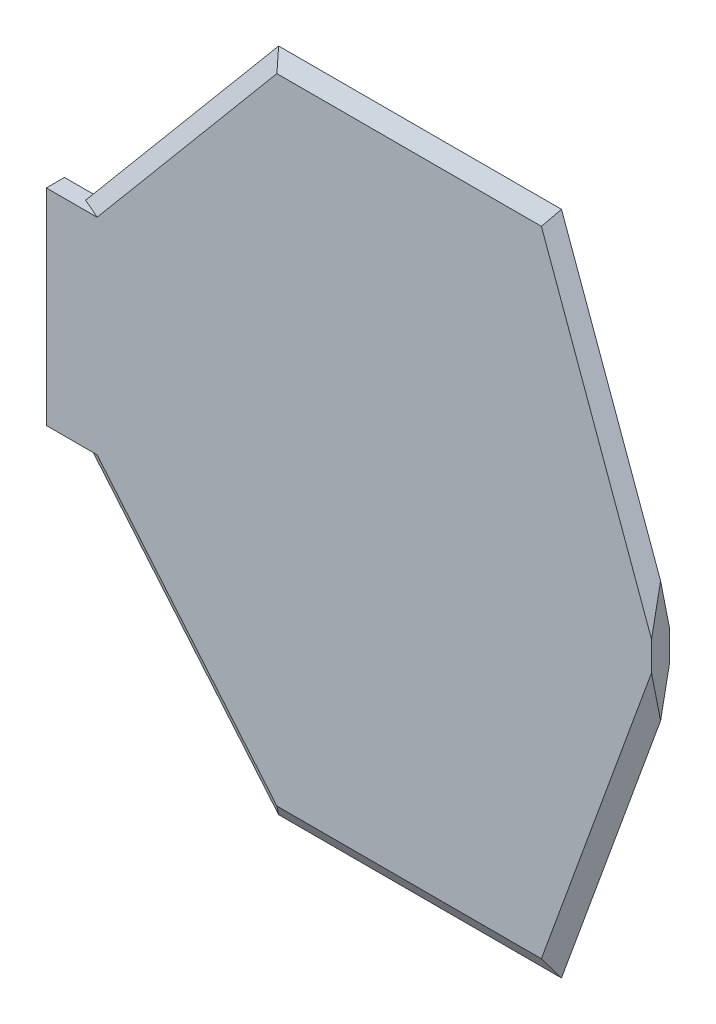
ISO-10303-21;
HEADER;
FILE_DESCRIPTION(('STEP AP214'),'2;1');
FILE_NAME('part.step','',(''),(''),'','','');
FILE_SCHEMA(('AUTOMOTIVE_DESIGN { 1 0 10303 214 1 1 1 1 }'));
ENDSEC;
DATA;
#1=APPLICATION_CONTEXT('core data for automotive mechanical design processes');
#2=APPLICATION_PROTOCOL_DEFINITION('international standard','automotive_design',2000,#1);
#3=PRODUCT_CONTEXT('',#1,'mechanical');
#4=PRODUCT('Part','Part','',(#3));
#5=PRODUCT_RELATED_PRODUCT_CATEGORY('part','',(#4));
#6=PRODUCT_DEFINITION_FORMATION('','',#4);
#7=PRODUCT_DEFINITION_CONTEXT('part definition',#1,'design');
#8=PRODUCT_DEFINITION('design','',#6,#7);
#9=PRODUCT_DEFINITION_SHAPE('','',#8);
#10=(LENGTH_UNIT() NAMED_UNIT(*) SI_UNIT(.MILLI.,.METRE.));
#11=(NAMED_UNIT(*) PLANE_ANGLE_UNIT() SI_UNIT($,.RADIAN.));
#12=(NAMED_UNIT(*) SI_UNIT($,.STERADIAN.) SOLID_ANGLE_UNIT());
#13=UNCERTAINTY_MEASURE_WITH_UNIT(LENGTH_MEASURE(1.E-05),#10,'distance_accuracy_value','');
#14=(GEOMETRIC_REPRESENTATION_CONTEXT(3) GLOBAL_UNCERTAINTY_ASSIGNED_CONTEXT((#13)) GLOBAL_UNIT_ASSIGNED_CONTEXT((#10,
#11,#12)) REPRESENTATION_CONTEXT('',''));
#15=CARTESIAN_POINT('',(0.,0.,0.));
#16=DIRECTION('',(0.,0.,1.));
#17=DIRECTION('',(1.,0.,0.));
#18=AXIS2_PLACEMENT_3D('',#15,#16,#17);
#19=CARTESIAN_POINT('',(40.,-17.,1.5));
#20=DIRECTION('',(1.,0.,0.));
#21=DIRECTION('',(0.,0.,-1.));
#22=AXIS2_PLACEMENT_3D('',#19,#20,#21);
#23=PLANE('',#22);
#24=DIRECTION('',(0.,-1.,0.));
#25=VECTOR('',#24,1.);
#26=CARTESIAN_POINT('',(40.,-17.,-1.5));
#27=LINE('',#26,#25);
#28=CARTESIAN_POINT('',(40.,17.,-1.5));
#29=VERTEX_POINT('',#28);
#30=CARTESIAN_POINT('',(40.,-17.,-1.5));
#31=VERTEX_POINT('',#30);
#32=EDGE_CURVE('E165',#29,#31,#27,.T.);
#33=ORIENTED_EDGE('',*,*,#32,.T.);
#34=DIRECTION('',(0.,0.,-1.));
#35=VECTOR('',#34,1.);
#36=CARTESIAN_POINT('',(40.,-17.,1.5));
#37=LINE('',#36,#35);
#38=CARTESIAN_POINT('',(40.,-17.,1.5));
#39=VERTEX_POINT('',#38);
#40=EDGE_CURVE('E152',#39,#31,#37,.T.);
#41=ORIENTED_EDGE('',*,*,#40,.F.);
#42=DIRECTION('',(0.,-1.,0.));
#43=VECTOR('',#42,1.);
#44=CARTESIAN_POINT('',(40.,-17.,1.5));
#45=LINE('',#44,#43);
#46=CARTESIAN_POINT('',(40.,17.,1.5));
#47=VERTEX_POINT('',#46);
#48=EDGE_CURVE('E147',#47,#39,#45,.T.);
#49=ORIENTED_EDGE('',*,*,#48,.F.);
#50=DIRECTION('',(0.,0.,-1.));
#51=VECTOR('',#50,1.);
#52=CARTESIAN_POINT('',(40.,17.,1.5));
#53=LINE('',#52,#51);
#54=EDGE_CURVE('E149',#47,#29,#53,.T.);
#55=ORIENTED_EDGE('',*,*,#54,.T.);
#56=EDGE_LOOP('',(#33,#41,#49,#55));
#57=FACE_BOUND('',#56,.T.);
#58=ADVANCED_FACE('F45',(#57),#23,.F.);
#59=CARTESIAN_POINT('',(45.,-17.,1.5));
#60=DIRECTION('',(0.,1.,0.));
#61=DIRECTION('',(0.,0.,1.));
#62=AXIS2_PLACEMENT_3D('',#59,#60,#61);
#63=PLANE('',#62);
#64=DIRECTION('',(1.,0.,0.));
#65=VECTOR('',#64,1.);
#66=CARTESIAN_POINT('',(45.,-17.,-1.5));
#67=LINE('',#66,#65);
#68=CARTESIAN_POINT('',(48.3915476245414,-17.,-1.5));
#69=VERTEX_POINT('',#68);
#70=EDGE_CURVE('E179',#31,#69,#67,.T.);
#71=ORIENTED_EDGE('',*,*,#70,.T.);
#72=DIRECTION('',(0.91454607135198,0.,-0.404481746652007));
#73=VECTOR('',#72,1.);
#74=CARTESIAN_POINT('',(44.4451242114987,-17.,0.245408225062));
#75=LINE('',#74,#73);
#76=CARTESIAN_POINT('',(45.,-17.,0.));
#77=VERTEX_POINT('',#76);
#78=EDGE_CURVE('E11',#69,#77,#75,.F.);
#79=ORIENTED_EDGE('',*,*,#78,.T.);
#80=DIRECTION('',(0.91454607135198,0.,0.404481746652007));
#81=VECTOR('',#80,1.);
#82=CARTESIAN_POINT('',(45.5548757885013,-17.,0.245408225061977));
#83=LINE('',#82,#81);
#84=CARTESIAN_POINT('',(48.3915476245414,-17.,1.5));
#85=VERTEX_POINT('',#84);
#86=EDGE_CURVE('E244',#77,#85,#83,.T.);
#87=ORIENTED_EDGE('',*,*,#86,.T.);
#88=DIRECTION('',(1.,0.,0.));
#89=VECTOR('',#88,1.);
#90=CARTESIAN_POINT('',(45.,-17.,1.5));
#91=LINE('',#90,#89);
#92=EDGE_CURVE('E156',#39,#85,#91,.T.);
#93=ORIENTED_EDGE('',*,*,#92,.F.);
#94=ORIENTED_EDGE('',*,*,#40,.T.);
#95=EDGE_LOOP('',(#71,#79,#87,#93,#94));
#96=FACE_BOUND('',#95,.T.);
#97=ADVANCED_FACE('F270',(#96),#63,.F.);
#98=CARTESIAN_POINT('',(140.,-10.,1.5));
#99=DIRECTION('',(-1.,0.,0.));
#100=DIRECTION('',(0.,0.,1.));
#101=AXIS2_PLACEMENT_3D('',#98,#99,#100);
#102=PLANE('',#101);
#103=DIRECTION('',(0.,-0.981055946010023,-0.19372462620529));
#104=VECTOR('',#103,1.);
#105=CARTESIAN_POINT('',(140.,-43.6673410123509,-6.64813569447251));
#106=LINE('',#105,#104);
#107=CARTESIAN_POINT('',(140.,-2.40373334128617,1.5));
#108=VERTEX_POINT('',#107);
#109=CARTESIAN_POINT('',(140.,-10.,0.));
#110=VERTEX_POINT('',#109);
#111=EDGE_CURVE('E232',#108,#110,#106,.T.);
#112=ORIENTED_EDGE('',*,*,#111,.T.);
#113=DIRECTION('',(0.,-0.981055946010023,0.19372462620529));
#114=VECTOR('',#113,1.);
#115=CARTESIAN_POINT('',(140.,-53.3111846140729,8.55246133922713));
#116=LINE('',#115,#114);
#117=CARTESIAN_POINT('',(140.,-2.40373334128618,-1.5));
#118=VERTEX_POINT('',#117);
#119=EDGE_CURVE('E247',#110,#118,#116,.F.);
#120=ORIENTED_EDGE('',*,*,#119,.T.);
#121=DIRECTION('',(0.,1.,0.));
#122=VECTOR('',#121,1.);
#123=CARTESIAN_POINT('',(140.,-10.,-1.5));
#124=LINE('',#123,#122);
#125=CARTESIAN_POINT('',(140.,2.40373334128617,-1.5));
#126=VERTEX_POINT('',#125);
#127=EDGE_CURVE('E157',#118,#126,#124,.T.);
#128=ORIENTED_EDGE('',*,*,#127,.T.);
#129=DIRECTION('',(0.,0.981055946010023,0.19372462620529));
#130=VECTOR('',#129,1.);
#131=CARTESIAN_POINT('',(140.,43.6673410123509,6.64813569447251));
#132=LINE('',#131,#130);
#133=CARTESIAN_POINT('',(140.,10.,0.));
#134=VERTEX_POINT('',#133);
#135=EDGE_CURVE('E215',#126,#134,#132,.T.);
#136=ORIENTED_EDGE('',*,*,#135,.T.);
#137=DIRECTION('',(0.,0.981055946010023,-0.19372462620529));
#138=VECTOR('',#137,1.);
#139=CARTESIAN_POINT('',(140.,53.3111846140729,-8.55246133922713));
#140=LINE('',#139,#138);
#141=CARTESIAN_POINT('',(140.,2.4037333412862,1.5));
#142=VERTEX_POINT('',#141);
#143=EDGE_CURVE('E186',#134,#142,#140,.F.);
#144=ORIENTED_EDGE('',*,*,#143,.T.);
#145=DIRECTION('',(0.,1.,0.));
#146=VECTOR('',#145,1.);
#147=CARTESIAN_POINT('',(140.,-10.,1.5));
#148=LINE('',#147,#146);
#149=EDGE_CURVE('E176',#108,#142,#148,.T.);
#150=ORIENTED_EDGE('',*,*,#149,.F.);
#151=EDGE_LOOP('',(#112,#120,#128,#136,#144,#150));
#152=FACE_BOUND('',#151,.T.);
#153=ADVANCED_FACE('F286',(#152),#102,.F.);
#154=CARTESIAN_POINT('',(0.,0.,1.5));
#155=DIRECTION('',(0.,0.,1.));
#156=DIRECTION('',(1.,0.,0.));
#157=AXIS2_PLACEMENT_3D('',#154,#155,#156);
#158=PLANE('',#157);
#159=DIRECTION('',(1.,0.,0.));
#160=VECTOR('',#159,1.);
#161=CARTESIAN_POINT('',(123.621339458021,-52.4019237886467,1.5));
#162=LINE('',#161,#160);
#163=CARTESIAN_POINT('',(78.0972888185607,-52.4019237886467,1.5));
#164=VERTEX_POINT('',#163);
#165=CARTESIAN_POINT('',(121.802146909988,-52.4019237886467,1.5));
#166=VERTEX_POINT('',#165);
#167=EDGE_CURVE('E227',#164,#166,#162,.T.);
#168=ORIENTED_EDGE('',*,*,#167,.T.);
#169=DIRECTION('',(0.34202014332567,0.939692620785908,0.));
#170=VECTOR('',#169,1.);
#171=CARTESIAN_POINT('',(137.558606955952,-9.11140560182193,1.5));
#172=LINE('',#171,#170);
#173=EDGE_CURVE('E229',#166,#108,#172,.T.);
#174=ORIENTED_EDGE('',*,*,#173,.T.);
#175=ORIENTED_EDGE('',*,*,#149,.T.);
#176=DIRECTION('',(-0.34202014332567,0.939692620785908,0.));
#177=VECTOR('',#176,1.);
#178=CARTESIAN_POINT('',(124.395656022713,45.2763160642849,1.5));
#179=LINE('',#178,#177);
#180=CARTESIAN_POINT('',(121.802146909988,52.4019237886467,1.5));
#181=VERTEX_POINT('',#180);
#182=EDGE_CURVE('E192',#142,#181,#179,.T.);
#183=ORIENTED_EDGE('',*,*,#182,.T.);
#184=DIRECTION('',(-1.,0.,0.));
#185=VECTOR('',#184,1.);
#186=CARTESIAN_POINT('',(0.,52.4019237886467,1.5));
#187=LINE('',#186,#185);
#188=CARTESIAN_POINT('',(78.0972888185607,52.4019237886467,1.5));
#189=VERTEX_POINT('',#188);
#190=EDGE_CURVE('E190',#181,#189,#187,.T.);
#191=ORIENTED_EDGE('',*,*,#190,.T.);
#192=DIRECTION('',(-0.642787609686535,-0.766044443118982,0.));
#193=VECTOR('',#192,1.);
#194=CARTESIAN_POINT('',(20.0264599414093,-16.8041951506229,1.5));
#195=LINE('',#194,#193);
#196=CARTESIAN_POINT('',(48.3915476245414,17.,1.5));
#197=VERTEX_POINT('',#196);
#198=EDGE_CURVE('E169',#189,#197,#195,.T.);
#199=ORIENTED_EDGE('',*,*,#198,.T.);
#200=DIRECTION('',(1.,0.,0.));
#201=VECTOR('',#200,1.);
#202=CARTESIAN_POINT('',(45.,17.,1.5));
#203=LINE('',#202,#201);
#204=EDGE_CURVE('E161',#47,#197,#203,.T.);
#205=ORIENTED_EDGE('',*,*,#204,.F.);
#206=ORIENTED_EDGE('',*,*,#48,.T.);
#207=ORIENTED_EDGE('',*,*,#92,.T.);
#208=DIRECTION('',(0.642787609686535,-0.766044443118982,0.));
#209=VECTOR('',#208,1.);
#210=CARTESIAN_POINT('',(78.8760278292431,-53.3299888023207,1.5));
#211=LINE('',#210,#209);
#212=EDGE_CURVE('E219',#85,#164,#211,.T.);
#213=ORIENTED_EDGE('',*,*,#212,.T.);
#214=EDGE_LOOP('',(#168,#174,#175,#183,#191,#199,#205,#206,#207,#213));
#215=FACE_BOUND('',#214,.T.);
#216=ADVANCED_FACE('F167',(#215),#158,.T.);
#217=CARTESIAN_POINT('',(0.,0.,-1.5));
#218=DIRECTION('',(0.,0.,1.));
#219=DIRECTION('',(1.,0.,0.));
#220=AXIS2_PLACEMENT_3D('',#217,#218,#219);
#221=PLANE('',#220);
#222=ORIENTED_EDGE('',*,*,#127,.F.);
#223=DIRECTION('',(-0.34202014332567,-0.939692620785908,0.));
#224=VECTOR('',#223,1.);
#225=CARTESIAN_POINT('',(124.395656022713,-45.2763160642849,-1.5));
#226=LINE('',#225,#224);
#227=CARTESIAN_POINT('',(121.802146909988,-52.4019237886467,-1.5));
#228=VERTEX_POINT('',#227);
#229=EDGE_CURVE('E55',#118,#228,#226,.T.);
#230=ORIENTED_EDGE('',*,*,#229,.T.);
#231=DIRECTION('',(-1.,0.,0.));
#232=VECTOR('',#231,1.);
#233=CARTESIAN_POINT('',(0.,-52.4019237886467,-1.5));
#234=LINE('',#233,#232);
#235=CARTESIAN_POINT('',(78.0972888185607,-52.4019237886467,-1.5));
#236=VERTEX_POINT('',#235);
#237=EDGE_CURVE('E66',#228,#236,#234,.T.);
#238=ORIENTED_EDGE('',*,*,#237,.T.);
#239=DIRECTION('',(-0.642787609686535,0.766044443118982,0.));
#240=VECTOR('',#239,1.);
#241=CARTESIAN_POINT('',(20.0264599414093,16.8041951506229,-1.5));
#242=LINE('',#241,#240);
#243=EDGE_CURVE('E254',#236,#69,#242,.T.);
#244=ORIENTED_EDGE('',*,*,#243,.T.);
#245=ORIENTED_EDGE('',*,*,#70,.F.);
#246=ORIENTED_EDGE('',*,*,#32,.F.);
#247=DIRECTION('',(1.,0.,0.));
#248=VECTOR('',#247,1.);
#249=CARTESIAN_POINT('',(45.,17.,-1.5));
#250=LINE('',#249,#248);
#251=CARTESIAN_POINT('',(48.3915476245414,17.,-1.5));
#252=VERTEX_POINT('',#251);
#253=EDGE_CURVE('E164',#29,#252,#250,.T.);
#254=ORIENTED_EDGE('',*,*,#253,.T.);
#255=DIRECTION('',(0.642787609686535,0.766044443118982,0.));
#256=VECTOR('',#255,1.);
#257=CARTESIAN_POINT('',(78.8760278292431,53.3299888023207,-1.5));
#258=LINE('',#257,#256);
#259=CARTESIAN_POINT('',(78.0972888185607,52.4019237886467,-1.5));
#260=VERTEX_POINT('',#259);
#261=EDGE_CURVE('E202',#252,#260,#258,.T.);
#262=ORIENTED_EDGE('',*,*,#261,.T.);
#263=DIRECTION('',(1.,0.,0.));
#264=VECTOR('',#263,1.);
#265=CARTESIAN_POINT('',(123.621339458021,52.4019237886467,-1.5));
#266=LINE('',#265,#264);
#267=CARTESIAN_POINT('',(121.802146909988,52.4019237886467,-1.5));
#268=VERTEX_POINT('',#267);
#269=EDGE_CURVE('E210',#260,#268,#266,.T.);
#270=ORIENTED_EDGE('',*,*,#269,.T.);
#271=DIRECTION('',(0.34202014332567,-0.939692620785908,0.));
#272=VECTOR('',#271,1.);
#273=CARTESIAN_POINT('',(137.558606955952,9.11140560182193,-1.5));
#274=LINE('',#273,#272);
#275=EDGE_CURVE('E212',#268,#126,#274,.T.);
#276=ORIENTED_EDGE('',*,*,#275,.T.);
#277=EDGE_LOOP('',(#222,#230,#238,#244,#245,#246,#254,#262,#270,#276));
#278=FACE_BOUND('',#277,.T.);
#279=ADVANCED_FACE('F268',(#278),#221,.F.);
#280=CARTESIAN_POINT('',(45.,17.,1.5));
#281=DIRECTION('',(0.,1.,0.));
#282=DIRECTION('',(0.,0.,1.));
#283=AXIS2_PLACEMENT_3D('',#280,#281,#282);
#284=PLANE('',#283);
#285=ORIENTED_EDGE('',*,*,#253,.F.);
#286=ORIENTED_EDGE('',*,*,#54,.F.);
#287=ORIENTED_EDGE('',*,*,#204,.T.);
#288=DIRECTION('',(0.91454607135198,0.,0.404481746652007));
#289=VECTOR('',#288,1.);
#290=CARTESIAN_POINT('',(45.,17.,0.));
#291=LINE('',#290,#289);
#292=CARTESIAN_POINT('',(45.,17.,0.));
#293=VERTEX_POINT('',#292);
#294=EDGE_CURVE('E200',#197,#293,#291,.F.);
#295=ORIENTED_EDGE('',*,*,#294,.T.);
#296=DIRECTION('',(0.91454607135198,0.,-0.404481746652007));
#297=VECTOR('',#296,1.);
#298=CARTESIAN_POINT('',(24.6671438227727,17.,8.99273359605708));
#299=LINE('',#298,#297);
#300=EDGE_CURVE('E217',#293,#252,#299,.T.);
#301=ORIENTED_EDGE('',*,*,#300,.T.);
#302=EDGE_LOOP('',(#285,#286,#287,#295,#301));
#303=FACE_BOUND('',#302,.T.);
#304=ADVANCED_FACE('F160',(#303),#284,.T.);
#305=CARTESIAN_POINT('',(45.,17.,0.));
#306=DIRECTION('',(0.38302222155949,-0.321393804843267,-0.866025403784439));
#307=DIRECTION('',(0.642787609686535,0.766044443118982,0.));
#308=AXIS2_PLACEMENT_3D('',#305,#306,#307);
#309=PLANE('',#308);
#310=ORIENTED_EDGE('',*,*,#294,.F.);
#311=ORIENTED_EDGE('',*,*,#198,.F.);
#312=DIRECTION('',(-0.374453581815003,0.803018297611851,-0.463622830290398));
#313=VECTOR('',#312,1.);
#314=CARTESIAN_POINT('',(83.8412419969243,40.0839764465633,8.6117702138155));
#315=LINE('',#314,#313);
#316=CARTESIAN_POINT('',(76.8857859847363,55.,0.));
#317=VERTEX_POINT('',#316);
#318=EDGE_CURVE('E172',#317,#189,#315,.F.);
#319=ORIENTED_EDGE('',*,*,#318,.F.);
#320=DIRECTION('',(0.642787609686535,0.766044443118982,0.));
#321=VECTOR('',#320,1.);
#322=CARTESIAN_POINT('',(45.,17.,0.));
#323=LINE('',#322,#321);
#324=EDGE_CURVE('E197',#293,#317,#323,.T.);
#325=ORIENTED_EDGE('',*,*,#324,.F.);
#326=EDGE_LOOP('',(#310,#311,#319,#325));
#327=FACE_BOUND('',#326,.T.);
#328=ADVANCED_FACE('F299',(#327),#309,.F.);
#329=CARTESIAN_POINT('',(76.8857859847363,55.,0.));
#330=DIRECTION('',(0.,-0.500000000000001,-0.866025403784438));
#331=DIRECTION('',(1.,0.,0.));
#332=AXIS2_PLACEMENT_3D('',#329,#330,#331);
#333=PLANE('',#332);
#334=ORIENTED_EDGE('',*,*,#318,.T.);
#335=ORIENTED_EDGE('',*,*,#190,.F.);
#336=DIRECTION('',(0.518512392703885,0.740512440111149,-0.42753505663644));
#337=VECTOR('',#336,1.);
#338=CARTESIAN_POINT('',(111.05624749056,37.0551889521386,10.3604414890397));
#339=LINE('',#338,#337);
#340=CARTESIAN_POINT('',(123.621339458021,55.,0.));
#341=VERTEX_POINT('',#340);
#342=EDGE_CURVE('E203',#341,#181,#339,.F.);
#343=ORIENTED_EDGE('',*,*,#342,.F.);
#344=DIRECTION('',(1.,0.,0.));
#345=VECTOR('',#344,1.);
#346=CARTESIAN_POINT('',(76.8857859847363,55.,0.));
#347=LINE('',#346,#345);
#348=EDGE_CURVE('E194',#317,#341,#347,.T.);
#349=ORIENTED_EDGE('',*,*,#348,.F.);
#350=EDGE_LOOP('',(#334,#335,#343,#349));
#351=FACE_BOUND('',#350,.T.);
#352=ADVANCED_FACE('F295',(#351),#333,.F.);
#353=CARTESIAN_POINT('',(123.621339458021,55.,0.));
#354=DIRECTION('',(-0.469846310392958,-0.171010071662836,-0.866025403784436));
#355=DIRECTION('',(0.342020143325669,-0.939692620785908,0.));
#356=AXIS2_PLACEMENT_3D('',#353,#354,#355);
#357=PLANE('',#356);
#358=ORIENTED_EDGE('',*,*,#342,.T.);
#359=ORIENTED_EDGE('',*,*,#182,.F.);
#360=ORIENTED_EDGE('',*,*,#143,.F.);
#361=DIRECTION('',(0.342020143325669,-0.939692620785908,0.));
#362=VECTOR('',#361,1.);
#363=CARTESIAN_POINT('',(123.621339458021,55.,0.));
#364=LINE('',#363,#362);
#365=EDGE_CURVE('E183',#341,#134,#364,.T.);
#366=ORIENTED_EDGE('',*,*,#365,.F.);
#367=EDGE_LOOP('',(#358,#359,#360,#366));
#368=FACE_BOUND('',#367,.T.);
#369=ADVANCED_FACE('F292',(#368),#357,.F.);
#370=CARTESIAN_POINT('',(20.0264599414093,-16.8041951506229,-1.5));
#371=DIRECTION('',(-0.38302222155949,0.321393804843267,-0.866025403784439));
#372=DIRECTION('',(-0.642787609686535,-0.766044443118982,0.));
#373=AXIS2_PLACEMENT_3D('',#370,#371,#372);
#374=PLANE('',#373);
#375=ORIENTED_EDGE('',*,*,#300,.F.);
#376=ORIENTED_EDGE('',*,*,#324,.T.);
#377=DIRECTION('',(0.374453581815003,-0.803018297611851,-0.463622830290398));
#378=VECTOR('',#377,1.);
#379=CARTESIAN_POINT('',(90.7646602937276,25.2366579954865,-17.1838735182888));
#380=LINE('',#379,#378);
#381=EDGE_CURVE('E206',#260,#317,#380,.F.);
#382=ORIENTED_EDGE('',*,*,#381,.F.);
#383=ORIENTED_EDGE('',*,*,#261,.F.);
#384=EDGE_LOOP('',(#375,#376,#382,#383));
#385=FACE_BOUND('',#384,.T.);
#386=ADVANCED_FACE('F304',(#385),#374,.T.);
#387=CARTESIAN_POINT('',(0.,52.4019237886467,-1.5));
#388=DIRECTION('',(0.,0.500000000000001,-0.866025403784438));
#389=DIRECTION('',(-1.,0.,0.));
#390=AXIS2_PLACEMENT_3D('',#387,#388,#389);
#391=PLANE('',#390);
#392=ORIENTED_EDGE('',*,*,#381,.T.);
#393=ORIENTED_EDGE('',*,*,#348,.T.);
#394=DIRECTION('',(-0.518512392703885,-0.740512440111149,-0.42753505663644));
#395=VECTOR('',#394,1.);
#396=CARTESIAN_POINT('',(89.055018353287,5.6341774138657,-28.501370958872));
#397=LINE('',#396,#395);
#398=EDGE_CURVE('E220',#268,#341,#397,.F.);
#399=ORIENTED_EDGE('',*,*,#398,.F.);
#400=ORIENTED_EDGE('',*,*,#269,.F.);
#401=EDGE_LOOP('',(#392,#393,#399,#400));
#402=FACE_BOUND('',#401,.T.);
#403=ADVANCED_FACE('F309',(#402),#391,.T.);
#404=CARTESIAN_POINT('',(124.395656022713,45.2763160642849,-1.5));
#405=DIRECTION('',(0.469846310392958,0.171010071662836,-0.866025403784436));
#406=DIRECTION('',(-0.342020143325669,0.939692620785908,0.));
#407=AXIS2_PLACEMENT_3D('',#404,#405,#406);
#408=PLANE('',#407);
#409=ORIENTED_EDGE('',*,*,#398,.T.);
#410=ORIENTED_EDGE('',*,*,#365,.T.);
#411=ORIENTED_EDGE('',*,*,#135,.F.);
#412=ORIENTED_EDGE('',*,*,#275,.F.);
#413=EDGE_LOOP('',(#409,#410,#411,#412));
#414=FACE_BOUND('',#413,.T.);
#415=ADVANCED_FACE('F311',(#414),#408,.T.);
#416=CARTESIAN_POINT('',(20.0264599414093,16.8041951506229,1.5));
#417=DIRECTION('',(-0.38302222155949,-0.321393804843267,0.866025403784439));
#418=DIRECTION('',(-0.642787609686535,0.766044443118982,0.));
#419=AXIS2_PLACEMENT_3D('',#416,#417,#418);
#420=PLANE('',#419);
#421=ORIENTED_EDGE('',*,*,#86,.F.);
#422=DIRECTION('',(-0.642787609686535,0.766044443118982,0.));
#423=VECTOR('',#422,1.);
#424=CARTESIAN_POINT('',(45.,-17.,0.));
#425=LINE('',#424,#423);
#426=CARTESIAN_POINT('',(76.8857859847363,-55.,0.));
#427=VERTEX_POINT('',#426);
#428=EDGE_CURVE('E241',#427,#77,#425,.T.);
#429=ORIENTED_EDGE('',*,*,#428,.F.);
#430=DIRECTION('',(0.374453581815003,0.803018297611851,0.463622830290398));
#431=VECTOR('',#430,1.);
#432=CARTESIAN_POINT('',(90.7646602937276,-25.2366579954865,17.1838735182888));
#433=LINE('',#432,#431);
#434=EDGE_CURVE('E223',#164,#427,#433,.F.);
#435=ORIENTED_EDGE('',*,*,#434,.F.);
#436=ORIENTED_EDGE('',*,*,#212,.F.);
#437=EDGE_LOOP('',(#421,#429,#435,#436));
#438=FACE_BOUND('',#437,.T.);
#439=ADVANCED_FACE('F277',(#438),#420,.T.);
#440=CARTESIAN_POINT('',(0.,-52.4019237886467,1.5));
#441=DIRECTION('',(0.,-0.500000000000001,0.866025403784438));
#442=DIRECTION('',(-1.,0.,0.));
#443=AXIS2_PLACEMENT_3D('',#440,#441,#442);
#444=PLANE('',#443);
#445=ORIENTED_EDGE('',*,*,#434,.T.);
#446=DIRECTION('',(-1.,0.,0.));
#447=VECTOR('',#446,1.);
#448=CARTESIAN_POINT('',(76.8857859847363,-55.,0.));
#449=LINE('',#448,#447);
#450=CARTESIAN_POINT('',(123.621339458021,-55.,0.));
#451=VERTEX_POINT('',#450);
#452=EDGE_CURVE('E238',#451,#427,#449,.T.);
#453=ORIENTED_EDGE('',*,*,#452,.F.);
#454=DIRECTION('',(-0.518512392703885,0.740512440111149,0.42753505663644));
#455=VECTOR('',#454,1.);
#456=CARTESIAN_POINT('',(89.055018353287,-5.6341774138657,28.501370958872));
#457=LINE('',#456,#455);
#458=EDGE_CURVE('E248',#166,#451,#457,.F.);
#459=ORIENTED_EDGE('',*,*,#458,.F.);
#460=ORIENTED_EDGE('',*,*,#167,.F.);
#461=EDGE_LOOP('',(#445,#453,#459,#460));
#462=FACE_BOUND('',#461,.T.);
#463=ADVANCED_FACE('F279',(#462),#444,.T.);
#464=CARTESIAN_POINT('',(124.395656022713,-45.2763160642849,1.5));
#465=DIRECTION('',(0.469846310392958,-0.171010071662836,0.866025403784436));
#466=DIRECTION('',(-0.342020143325669,-0.939692620785908,0.));
#467=AXIS2_PLACEMENT_3D('',#464,#465,#466);
#468=PLANE('',#467);
#469=ORIENTED_EDGE('',*,*,#458,.T.);
#470=DIRECTION('',(-0.342020143325669,-0.939692620785908,0.));
#471=VECTOR('',#470,1.);
#472=CARTESIAN_POINT('',(123.621339458021,-55.,0.));
#473=LINE('',#472,#471);
#474=EDGE_CURVE('E235',#110,#451,#473,.T.);
#475=ORIENTED_EDGE('',*,*,#474,.F.);
#476=ORIENTED_EDGE('',*,*,#111,.F.);
#477=ORIENTED_EDGE('',*,*,#173,.F.);
#478=EDGE_LOOP('',(#469,#475,#476,#477));
#479=FACE_BOUND('',#478,.T.);
#480=ADVANCED_FACE('F283',(#479),#468,.T.);
#481=CARTESIAN_POINT('',(45.,-17.,0.));
#482=DIRECTION('',(0.38302222155949,0.321393804843267,0.866025403784439));
#483=DIRECTION('',(0.642787609686535,-0.766044443118982,0.));
#484=AXIS2_PLACEMENT_3D('',#481,#482,#483);
#485=PLANE('',#484);
#486=ORIENTED_EDGE('',*,*,#78,.F.);
#487=ORIENTED_EDGE('',*,*,#243,.F.);
#488=DIRECTION('',(-0.374453581815003,-0.803018297611851,0.463622830290398));
#489=VECTOR('',#488,1.);
#490=CARTESIAN_POINT('',(83.8412419969243,-40.0839764465633,-8.6117702138155));
#491=LINE('',#490,#489);
#492=EDGE_CURVE('E50',#427,#236,#491,.F.);
#493=ORIENTED_EDGE('',*,*,#492,.F.);
#494=ORIENTED_EDGE('',*,*,#428,.T.);
#495=EDGE_LOOP('',(#486,#487,#493,#494));
#496=FACE_BOUND('',#495,.T.);
#497=ADVANCED_FACE('F48',(#496),#485,.F.);
#498=CARTESIAN_POINT('',(76.8857859847363,-55.,0.));
#499=DIRECTION('',(0.,0.500000000000001,0.866025403784438));
#500=DIRECTION('',(1.,0.,0.));
#501=AXIS2_PLACEMENT_3D('',#498,#499,#500);
#502=PLANE('',#501);
#503=ORIENTED_EDGE('',*,*,#492,.T.);
#504=ORIENTED_EDGE('',*,*,#237,.F.);
#505=DIRECTION('',(0.518512392703885,-0.740512440111149,0.42753505663644));
#506=VECTOR('',#505,1.);
#507=CARTESIAN_POINT('',(111.05624749056,-37.0551889521386,-10.3604414890397));
#508=LINE('',#507,#506);
#509=EDGE_CURVE('E257',#451,#228,#508,.F.);
#510=ORIENTED_EDGE('',*,*,#509,.F.);
#511=ORIENTED_EDGE('',*,*,#452,.T.);
#512=EDGE_LOOP('',(#503,#504,#510,#511));
#513=FACE_BOUND('',#512,.T.);
#514=ADVANCED_FACE('F264',(#513),#502,.F.);
#515=CARTESIAN_POINT('',(123.621339458021,-55.,0.));
#516=DIRECTION('',(-0.469846310392958,0.171010071662836,0.866025403784436));
#517=DIRECTION('',(0.342020143325669,0.939692620785908,0.));
#518=AXIS2_PLACEMENT_3D('',#515,#516,#517);
#519=PLANE('',#518);
#520=ORIENTED_EDGE('',*,*,#509,.T.);
#521=ORIENTED_EDGE('',*,*,#229,.F.);
#522=ORIENTED_EDGE('',*,*,#119,.F.);
#523=ORIENTED_EDGE('',*,*,#474,.T.);
#524=EDGE_LOOP('',(#520,#521,#522,#523));
#525=FACE_BOUND('',#524,.T.);
#526=ADVANCED_FACE('F397',(#525),#519,.F.);
#527=CLOSED_SHELL('',(#58,#97,#153,#216,#279,#304,#328,#352,#369,#386,#403,#415,#439,#463,#480,
#497,#514,#526));
#528=MANIFOLD_SOLID_BREP('B2',#527);
#529=ADVANCED_BREP_SHAPE_REPRESENTATION('',(#18,#528),#14);
#530=SHAPE_DEFINITION_REPRESENTATION(#9,#529);
ENDSEC;
END-ISO-10303-21;
